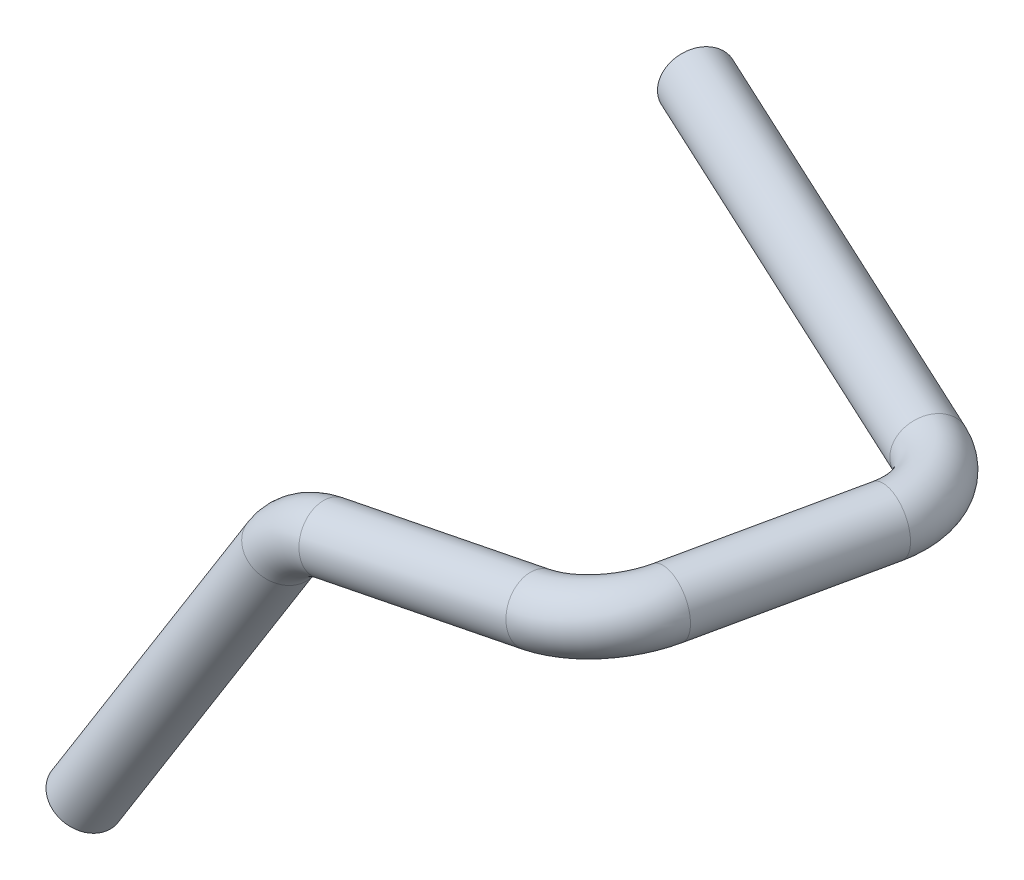
ISO-10303-21;
HEADER;
FILE_DESCRIPTION(('STEP AP214'),'2;1');
FILE_NAME('part.step','',(''),(''),'','','');
FILE_SCHEMA(('AUTOMOTIVE_DESIGN { 1 0 10303 214 1 1 1 1 }'));
ENDSEC;
DATA;
#1=APPLICATION_CONTEXT('core data for automotive mechanical design processes');
#2=APPLICATION_PROTOCOL_DEFINITION('international standard','automotive_design',2000,#1);
#3=PRODUCT_CONTEXT('',#1,'mechanical');
#4=PRODUCT('Part','Part','',(#3));
#5=PRODUCT_RELATED_PRODUCT_CATEGORY('part','',(#4));
#6=PRODUCT_DEFINITION_FORMATION('','',#4);
#7=PRODUCT_DEFINITION_CONTEXT('part definition',#1,'design');
#8=PRODUCT_DEFINITION('design','',#6,#7);
#9=PRODUCT_DEFINITION_SHAPE('','',#8);
#10=(LENGTH_UNIT() NAMED_UNIT(*) SI_UNIT(.MILLI.,.METRE.));
#11=(NAMED_UNIT(*) PLANE_ANGLE_UNIT() SI_UNIT($,.RADIAN.));
#12=(NAMED_UNIT(*) SI_UNIT($,.STERADIAN.) SOLID_ANGLE_UNIT());
#13=UNCERTAINTY_MEASURE_WITH_UNIT(LENGTH_MEASURE(1.E-05),#10,'distance_accuracy_value','');
#14=(GEOMETRIC_REPRESENTATION_CONTEXT(3) GLOBAL_UNCERTAINTY_ASSIGNED_CONTEXT((#13)) GLOBAL_UNIT_ASSIGNED_CONTEXT((#10,
#11,#12)) REPRESENTATION_CONTEXT('',''));
#15=CARTESIAN_POINT('',(0.,0.,0.));
#16=DIRECTION('',(0.,0.,1.));
#17=DIRECTION('',(1.,0.,0.));
#18=AXIS2_PLACEMENT_3D('',#15,#16,#17);
#19=CARTESIAN_POINT('',(-293.907053200826,-176.904078828045,0.));
#20=DIRECTION('',(-0.530756139601212,-0.847524583876844,0.));
#21=DIRECTION('',(0.134753289481936,-0.0843882727234141,0.987279175512457));
#22=AXIS2_PLACEMENT_3D('',#19,#20,#21);
#23=PLANE('',#22);
#24=CARTESIAN_POINT('',(-293.907053200826,-176.904078828045,0.));
#25=DIRECTION('',(-0.530756139601212,-0.847524583876844,0.));
#26=DIRECTION('',(0.134753289481936,-0.0843882727234141,0.987279175512457));
#27=AXIS2_PLACEMENT_3D('',#24,#25,#26);
#28=CIRCLE('',#27,10.);
#29=CARTESIAN_POINT('',(-302.382299039594,-171.596517432033,0.));
#30=VERTEX_POINT('',#29);
#31=EDGE_CURVE('E253',#30,#30,#28,.T.);
#32=ORIENTED_EDGE('',*,*,#31,.F.);
#33=EDGE_LOOP('',(#32));
#34=FACE_BOUND('',#33,.T.);
#35=CARTESIAN_POINT('',(-293.907053200826,-176.904078828045,0.));
#36=DIRECTION('',(-0.530756139601212,-0.847524583876844,0.));
#37=DIRECTION('',(0.847524583876845,-0.530756139601212,0.));
#38=AXIS2_PLACEMENT_3D('',#35,#36,#37);
#39=CIRCLE('',#38,12.);
#40=CARTESIAN_POINT('',(-283.736758194304,-183.273152503259,0.));
#41=VERTEX_POINT('',#40);
#42=EDGE_CURVE('E62',#41,#41,#39,.T.);
#43=ORIENTED_EDGE('',*,*,#42,.T.);
#44=EDGE_LOOP('',(#43));
#45=FACE_BOUND('',#44,.T.);
#46=ADVANCED_FACE('F43',(#34,#45),#23,.T.);
#47=CARTESIAN_POINT('',(-258.99237319652,-16.323468261362,-211.207155938666));
#48=DIRECTION('',(0.906907469997026,0.,0.421329848056833));
#49=DIRECTION('',(0.421329848056833,0.,-0.906907469997026));
#50=AXIS2_PLACEMENT_3D('',#47,#48,#49);
#51=PLANE('',#50);
#52=CARTESIAN_POINT('',(-258.99237319652,-16.323468261362,-211.207155938666));
#53=DIRECTION('',(0.906907469997026,0.,0.421329848056833));
#54=DIRECTION('',(0.421329848056833,0.,-0.906907469997026));
#55=AXIS2_PLACEMENT_3D('',#52,#53,#54);
#56=CIRCLE('',#55,10.);
#57=CARTESIAN_POINT('',(-254.779074715952,-16.323468261362,-220.276230638637));
#58=VERTEX_POINT('',#57);
#59=EDGE_CURVE('E65',#58,#58,#56,.T.);
#60=ORIENTED_EDGE('',*,*,#59,.T.);
#61=EDGE_LOOP('',(#60));
#62=FACE_BOUND('',#61,.T.);
#63=CARTESIAN_POINT('',(-258.99237319652,-16.323468261362,-211.207155938666));
#64=DIRECTION('',(0.906907469997026,0.,0.421329848056833));
#65=DIRECTION('',(0.421329848056833,0.,-0.906907469997026));
#66=AXIS2_PLACEMENT_3D('',#63,#64,#65);
#67=CIRCLE('',#66,12.);
#68=CARTESIAN_POINT('',(-253.936415019838,-16.323468261362,-222.090045578631));
#69=VERTEX_POINT('',#68);
#70=EDGE_CURVE('E11',#69,#69,#67,.T.);
#71=ORIENTED_EDGE('',*,*,#70,.F.);
#72=EDGE_LOOP('',(#71));
#73=FACE_BOUND('',#72,.T.);
#74=ADVANCED_FACE('F139',(#62,#73),#51,.F.);
#75=CARTESIAN_POINT('',(-293.907053200826,-176.904078828045,0.));
#76=DIRECTION('',(0.530756139601212,0.847524583876845,0.));
#77=DIRECTION('',(-0.847524583876845,0.530756139601212,0.));
#78=AXIS2_PLACEMENT_3D('',#75,#76,#77);
#79=CYLINDRICAL_SURFACE('',#78,12.);
#80=CARTESIAN_POINT('',(-215.210942182074,-51.2401745084316,0.));
#81=DIRECTION('',(0.530756139601212,0.847524583876845,0.));
#82=DIRECTION('',(-0.847524583876845,0.530756139601212,0.));
#83=AXIS2_PLACEMENT_3D('',#80,#81,#82);
#84=CIRCLE('',#83,12.);
#85=CARTESIAN_POINT('',(-225.381237188596,-44.871100833217,0.));
#86=VERTEX_POINT('',#85);
#87=EDGE_CURVE('E64',#86,#86,#84,.F.);
#88=ORIENTED_EDGE('',*,*,#87,.T.);
#89=EDGE_LOOP('',(#88));
#90=FACE_BOUND('',#89,.T.);
#91=ORIENTED_EDGE('',*,*,#42,.F.);
#92=EDGE_LOOP('',(#91));
#93=FACE_BOUND('',#92,.T.);
#94=ADVANCED_FACE('F142',(#90,#93),#79,.T.);
#95=CARTESIAN_POINT('',(-189.785204665768,-67.1628586964681,0.));
#96=DIRECTION('',(0.,0.,-1.));
#97=DIRECTION('',(-1.,0.,0.));
#98=AXIS2_PLACEMENT_3D('',#95,#96,#97);
#99=TOROIDAL_SURFACE('',#98,30.,12.);
#100=CARTESIAN_POINT('',(-195.66904996388,-37.7455106768406,0.));
#101=DIRECTION('',(-0.980578267320918,-0.196128176603735,0.));
#102=DIRECTION('',(0.196128176603735,-0.980578267320918,0.));
#103=AXIS2_PLACEMENT_3D('',#100,#101,#102);
#104=CIRCLE('',#103,12.);
#105=CARTESIAN_POINT('',(-198.022588083125,-25.9785714689896,0.));
#106=VERTEX_POINT('',#105);
#107=EDGE_CURVE('E69',#106,#106,#104,.T.);
#108=CARTESIAN_POINT('',(-189.785204665768,-67.1628586964681,0.));
#109=DIRECTION('',(0.,0.,-1.));
#110=DIRECTION('',(-1.,0.,0.));
#111=AXIS2_PLACEMENT_3D('',#108,#109,#110);
#112=CIRCLE('',#111,42.);
#113=EDGE_CURVE('',#86,#106,#112,.T.);
#114=ORIENTED_EDGE('',*,*,#87,.F.);
#115=ORIENTED_EDGE('',*,*,#107,.T.);
#116=ORIENTED_EDGE('',*,*,#113,.T.);
#117=ORIENTED_EDGE('',*,*,#113,.F.);
#118=EDGE_LOOP('',(#114,#116,#115,#117));
#119=FACE_BOUND('',#118,.T.);
#120=ADVANCED_FACE('F148',(#119),#99,.T.);
#121=CARTESIAN_POINT('',(-195.66904996388,-37.7455106768405,0.));
#122=DIRECTION('',(0.980578267320918,0.196128176603737,0.));
#123=DIRECTION('',(-0.196128176603737,0.980578267320918,0.));
#124=AXIS2_PLACEMENT_3D('',#121,#122,#123);
#125=CYLINDRICAL_SURFACE('',#124,12.);
#126=CARTESIAN_POINT('',(-112.434772165673,-21.0975921174252,0.));
#127=DIRECTION('',(0.980578267320918,0.196128176603737,0.));
#128=DIRECTION('',(-0.196128176603737,0.980578267320918,0.));
#129=AXIS2_PLACEMENT_3D('',#126,#127,#128);
#130=CIRCLE('',#129,12.);
#131=CARTESIAN_POINT('',(-112.533874178971,-20.6021136901504,11.9893569435173));
#132=VERTEX_POINT('',#131);
#133=EDGE_CURVE('E83',#132,#132,#130,.F.);
#134=ORIENTED_EDGE('',*,*,#133,.T.);
#135=EDGE_LOOP('',(#134));
#136=FACE_BOUND('',#135,.T.);
#137=ORIENTED_EDGE('',*,*,#107,.F.);
#138=EDGE_LOOP('',(#137));
#139=FACE_BOUND('',#138,.T.);
#140=ADVANCED_FACE('F100',(#136,#139),#125,.T.);
#141=CARTESIAN_POINT('',(-112.187017132428,-22.336288185612,-29.9733923587932));
#142=DIRECTION('',(-0.195954226331949,0.979708571497181,-0.0421076729064874));
#143=DIRECTION('',(-0.980578267320918,-0.196128176603737,0.));
#144=AXIS2_PLACEMENT_3D('',#141,#142,#143);
#145=TOROIDAL_SURFACE('',#144,30.,12.);
#146=CARTESIAN_POINT('',(-83.4517092703334,-16.323468261362,-23.7985985461068));
#147=DIRECTION('',(-0.210089476004418,0.,0.97768216311447));
#148=DIRECTION('',(0.97768216311447,0.,0.210089476004418));
#149=AXIS2_PLACEMENT_3D('',#146,#147,#148);
#150=CIRCLE('',#149,12.);
#151=CARTESIAN_POINT('',(-71.9575861254956,-13.918340291662,-21.3286810210322));
#152=VERTEX_POINT('',#151);
#153=EDGE_CURVE('E59',#152,#152,#150,.T.);
#154=CARTESIAN_POINT('',(-112.187017132428,-22.336288185612,-29.9733923587932));
#155=DIRECTION('',(-0.195954226331949,0.979708571497181,-0.0421076729064874));
#156=DIRECTION('',(-0.980578267320918,-0.196128176603737,0.));
#157=AXIS2_PLACEMENT_3D('',#154,#155,#156);
#158=CIRCLE('',#157,42.);
#159=EDGE_CURVE('',#132,#152,#158,.T.);
#160=ORIENTED_EDGE('',*,*,#133,.F.);
#161=ORIENTED_EDGE('',*,*,#153,.T.);
#162=ORIENTED_EDGE('',*,*,#159,.T.);
#163=ORIENTED_EDGE('',*,*,#159,.F.);
#164=EDGE_LOOP('',(#160,#162,#161,#163));
#165=FACE_BOUND('',#164,.T.);
#166=ADVANCED_FACE('F88',(#165),#145,.T.);
#167=CARTESIAN_POINT('',(-83.4517092703334,-16.323468261362,-23.7985985461067));
#168=DIRECTION('',(0.210089476004422,0.,-0.977682163114469));
#169=DIRECTION('',(-0.977682163114469,0.,-0.210089476004422));
#170=AXIS2_PLACEMENT_3D('',#167,#168,#169);
#171=CYLINDRICAL_SURFACE('',#170,12.);
#172=CARTESIAN_POINT('',(-67.8016970883487,-16.323468261362,-96.628223588955));
#173=DIRECTION('',(0.210089476004422,0.,-0.977682163114469));
#174=DIRECTION('',(-0.977682163114469,0.,-0.210089476004422));
#175=AXIS2_PLACEMENT_3D('',#172,#173,#174);
#176=CIRCLE('',#175,12.);
#177=CARTESIAN_POINT('',(-56.0695111309751,-16.323468261362,-94.107149876902));
#178=VERTEX_POINT('',#177);
#179=EDGE_CURVE('E54',#178,#178,#176,.F.);
#180=ORIENTED_EDGE('',*,*,#179,.T.);
#181=EDGE_LOOP('',(#180));
#182=FACE_BOUND('',#181,.T.);
#183=ORIENTED_EDGE('',*,*,#153,.F.);
#184=EDGE_LOOP('',(#183));
#185=FACE_BOUND('',#184,.T.);
#186=ADVANCED_FACE('F91',(#182,#185),#171,.T.);
#187=CARTESIAN_POINT('',(-97.1321619817828,-16.323468261362,-102.930907869088));
#188=DIRECTION('',(0.,1.,0.));
#189=DIRECTION('',(0.,0.,1.));
#190=AXIS2_PLACEMENT_3D('',#187,#188,#189);
#191=TOROIDAL_SURFACE('',#190,30.,12.);
#192=CARTESIAN_POINT('',(-84.492266540078,-16.323468261362,-130.138131968998));
#193=DIRECTION('',(0.906907469997027,0.,0.421329848056829));
#194=DIRECTION('',(0.421329848056829,0.,-0.906907469997028));
#195=AXIS2_PLACEMENT_3D('',#192,#193,#194);
#196=CIRCLE('',#195,12.);
#197=CARTESIAN_POINT('',(-79.436308363396,-16.323468261362,-141.021021608963));
#198=VERTEX_POINT('',#197);
#199=EDGE_CURVE('E50',#198,#198,#196,.T.);
#200=CARTESIAN_POINT('',(-97.1321619817828,-16.323468261362,-102.930907869088));
#201=DIRECTION('',(0.,1.,0.));
#202=DIRECTION('',(0.,0.,1.));
#203=AXIS2_PLACEMENT_3D('',#200,#201,#202);
#204=CIRCLE('',#203,42.);
#205=EDGE_CURVE('',#178,#198,#204,.T.);
#206=ORIENTED_EDGE('',*,*,#179,.F.);
#207=ORIENTED_EDGE('',*,*,#199,.T.);
#208=ORIENTED_EDGE('',*,*,#205,.T.);
#209=ORIENTED_EDGE('',*,*,#205,.F.);
#210=EDGE_LOOP('',(#206,#208,#207,#209));
#211=FACE_BOUND('',#210,.T.);
#212=ADVANCED_FACE('F93',(#211),#191,.T.);
#213=CARTESIAN_POINT('',(-84.492266540078,-16.323468261362,-130.138131968998));
#214=DIRECTION('',(-0.906907469997026,0.,-0.421329848056833));
#215=DIRECTION('',(-0.421329848056833,0.,0.906907469997026));
#216=AXIS2_PLACEMENT_3D('',#213,#214,#215);
#217=CYLINDRICAL_SURFACE('',#216,12.);
#218=ORIENTED_EDGE('',*,*,#70,.T.);
#219=EDGE_LOOP('',(#218));
#220=FACE_BOUND('',#219,.T.);
#221=ORIENTED_EDGE('',*,*,#199,.F.);
#222=EDGE_LOOP('',(#221));
#223=FACE_BOUND('',#222,.T.);
#224=ADVANCED_FACE('F45',(#220,#223),#217,.T.);
#225=CARTESIAN_POINT('',(-293.907053200826,-176.904078828045,0.));
#226=DIRECTION('',(0.530756139601212,0.847524583876845,0.));
#227=DIRECTION('',(-0.847524583876845,0.530756139601212,0.));
#228=AXIS2_PLACEMENT_3D('',#225,#226,#227);
#229=CYLINDRICAL_SURFACE('',#228,10.);
#230=CARTESIAN_POINT('',(-215.210942182074,-51.2401745084317,0.));
#231=DIRECTION('',(-0.530756139601212,-0.847524583876844,0.));
#232=DIRECTION('',(0.134753289481936,-0.0843882727234141,0.987279175512457));
#233=AXIS2_PLACEMENT_3D('',#230,#231,#232);
#234=CIRCLE('',#233,10.);
#235=CARTESIAN_POINT('',(-223.686188020842,-45.9326131124195,0.));
#236=VERTEX_POINT('',#235);
#237=EDGE_CURVE('E254',#236,#236,#234,.T.);
#238=CARTESIAN_POINT('',(-223.686188020842,-45.9326131124195,0.));
#239=CARTESIAN_POINT('',(-224.505939177287,-47.2416121157488,0.));
#240=CARTESIAN_POINT('',(-225.325690333733,-48.5506111190781,0.));
#241=CARTESIAN_POINT('',(-226.965192646623,-51.1686091257368,0.));
#242=CARTESIAN_POINT('',(-227.784943803069,-52.477608129066,0.));
#243=CARTESIAN_POINT('',(-229.424446115959,-55.0956061357247,0.));
#244=CARTESIAN_POINT('',(-230.244197272405,-56.404605139054,0.));
#245=CARTESIAN_POINT('',(-231.883699585295,-59.0226031457126,0.));
#246=CARTESIAN_POINT('',(-232.703450741741,-60.3316021490419,0.));
#247=CARTESIAN_POINT('',(-234.342953054631,-62.9496001557005,0.));
#248=CARTESIAN_POINT('',(-235.162704211077,-64.2585991590298,0.));
#249=CARTESIAN_POINT('',(-236.802206523967,-66.8765971656884,0.));
#250=CARTESIAN_POINT('',(-237.621957680413,-68.1855961690177,0.));
#251=CARTESIAN_POINT('',(-239.261459993303,-70.8035941756763,0.));
#252=CARTESIAN_POINT('',(-240.081211149749,-72.1125931790056,0.));
#253=CARTESIAN_POINT('',(-241.720713462639,-74.7305911856642,0.));
#254=CARTESIAN_POINT('',(-242.540464619085,-76.0395901889935,0.));
#255=CARTESIAN_POINT('',(-244.179966931975,-78.6575881956521,0.));
#256=CARTESIAN_POINT('',(-244.999718088421,-79.9665871989814,0.));
#257=CARTESIAN_POINT('',(-246.639220401311,-82.5845852056401,0.));
#258=CARTESIAN_POINT('',(-247.458971557757,-83.8935842089693,0.));
#259=CARTESIAN_POINT('',(-249.098473870647,-86.511582215628,0.));
#260=CARTESIAN_POINT('',(-249.918225027093,-87.8205812189573,0.));
#261=CARTESIAN_POINT('',(-251.557727339983,-90.4385792256159,0.));
#262=CARTESIAN_POINT('',(-252.377478496429,-91.7475782289452,0.));
#263=CARTESIAN_POINT('',(-254.016980809319,-94.3655762356038,0.));
#264=CARTESIAN_POINT('',(-254.836731965765,-95.6745752389331,0.));
#265=CARTESIAN_POINT('',(-256.476234278655,-98.2925732455917,0.));
#266=CARTESIAN_POINT('',(-257.295985435101,-99.601572248921,0.));
#267=CARTESIAN_POINT('',(-258.935487747991,-102.21957025558,0.));
#268=CARTESIAN_POINT('',(-259.755238904437,-103.528569258909,0.));
#269=CARTESIAN_POINT('',(-261.394741217327,-106.146567265568,0.));
#270=CARTESIAN_POINT('',(-262.214492373773,-107.455566268897,0.));
#271=CARTESIAN_POINT('',(-263.853994686663,-110.073564275555,0.));
#272=CARTESIAN_POINT('',(-264.673745843109,-111.382563278885,0.));
#273=CARTESIAN_POINT('',(-266.313248155999,-114.000561285543,0.));
#274=CARTESIAN_POINT('',(-267.132999312445,-115.309560288873,0.));
#275=CARTESIAN_POINT('',(-268.772501625336,-117.927558295531,0.));
#276=CARTESIAN_POINT('',(-269.592252781781,-119.236557298861,0.));
#277=CARTESIAN_POINT('',(-271.231755094671,-121.854555305519,0.));
#278=CARTESIAN_POINT('',(-272.051506251117,-123.163554308848,0.));
#279=CARTESIAN_POINT('',(-273.691008564008,-125.781552315507,0.));
#280=CARTESIAN_POINT('',(-274.510759720453,-127.090551318836,0.));
#281=CARTESIAN_POINT('',(-276.150262033344,-129.708549325495,0.));
#282=CARTESIAN_POINT('',(-276.970013189789,-131.017548328824,0.));
#283=CARTESIAN_POINT('',(-278.60951550268,-133.635546335483,0.));
#284=CARTESIAN_POINT('',(-279.429266659125,-134.944545338812,0.));
#285=CARTESIAN_POINT('',(-281.068768972016,-137.562543345471,0.));
#286=CARTESIAN_POINT('',(-281.888520128461,-138.8715423488,0.));
#287=CARTESIAN_POINT('',(-283.528022441352,-141.489540355459,0.));
#288=CARTESIAN_POINT('',(-284.347773597797,-142.798539358788,0.));
#289=CARTESIAN_POINT('',(-285.987275910688,-145.416537365447,0.));
#290=CARTESIAN_POINT('',(-286.807027067133,-146.725536368776,0.));
#291=CARTESIAN_POINT('',(-288.446529380024,-149.343534375435,0.));
#292=CARTESIAN_POINT('',(-289.266280536469,-150.652533378764,0.));
#293=CARTESIAN_POINT('',(-290.90578284936,-153.270531385422,0.));
#294=CARTESIAN_POINT('',(-291.725534005805,-154.579530388752,0.));
#295=CARTESIAN_POINT('',(-293.365036318696,-157.19752839541,0.));
#296=CARTESIAN_POINT('',(-294.184787475141,-158.50652739874,0.));
#297=CARTESIAN_POINT('',(-295.824289788032,-161.124525405398,0.));
#298=CARTESIAN_POINT('',(-296.644040944477,-162.433524408728,0.));
#299=CARTESIAN_POINT('',(-298.283543257368,-165.051522415386,0.));
#300=CARTESIAN_POINT('',(-299.103294413813,-166.360521418715,0.));
#301=CARTESIAN_POINT('',(-300.742796726704,-168.978519425374,0.));
#302=CARTESIAN_POINT('',(-301.562547883149,-170.287518428703,0.));
#303=CARTESIAN_POINT('',(-302.382299039594,-171.596517432033,0.));
#304=B_SPLINE_CURVE_WITH_KNOTS('',3,(#238,#239,#240,#241,#242,#243,#244,#245,#246,#247,#248,
#249,#250,#251,#252,#253,#254,#255,#256,#257,#258,#259,#260,#261,#262,#263,#264,#265,#266,#267,
#268,#269,#270,#271,#272,#273,#274,#275,#276,#277,#278,#279,#280,#281,#282,#283,#284,#285,#286,
#287,#288,#289,#290,#291,#292,#293,#294,#295,#296,#297,#298,#299,#300,#301,#302,#303),
.UNSPECIFIED.,.F.,.F.,(4,2,2,2,2,2,2,2,2,2,2,2,2,2,2,2,2,2,2,2,2,2,2,2,2,2,2,2,2,2,2,2,4),(0.,
4.63349038446129,9.26698076892258,13.9004711533839,18.5339615378452,23.1674519223064,
27.8009423067677,32.434432691229,37.0679230756903,41.7014134601516,46.3349038446129,
50.9683942290741,55.6018846135354,60.2353749979967,64.868865382458,69.5023557669193,
74.1358461513806,78.7693365358419,83.4028269203031,88.0363173047644,92.6698076892257,
97.303298073687,101.936788458148,106.57027884261,111.203769227071,115.837259611532,
120.470749995993,125.104240380455,129.737730764916,134.371221149377,139.004711533839,
143.6382019183,148.271692302761),.UNSPECIFIED.);
#305=EDGE_CURVE('BSEAM103',#236,#30,#304,.T.);
#306=ORIENTED_EDGE('',*,*,#237,.F.);
#307=ORIENTED_EDGE('',*,*,#31,.T.);
#308=ORIENTED_EDGE('',*,*,#305,.T.);
#309=ORIENTED_EDGE('',*,*,#305,.F.);
#310=EDGE_LOOP('',(#306,#308,#307,#309));
#311=FACE_BOUND('',#310,.T.);
#312=ADVANCED_FACE('F103',(#311),#229,.F.);
#313=CARTESIAN_POINT('',(-189.785204665768,-67.1628586964681,0.));
#314=DIRECTION('',(0.,0.,-1.));
#315=DIRECTION('',(-1.,0.,0.));
#316=AXIS2_PLACEMENT_3D('',#313,#314,#315);
#317=TOROIDAL_SURFACE('',#316,30.,10.);
#318=CARTESIAN_POINT('',(-195.66904996388,-37.7455106768406,0.));
#319=DIRECTION('',(-0.980578267320918,-0.196128176603737,0.));
#320=DIRECTION('',(0.0311836582209251,-0.155908335439143,0.987279175512457));
#321=AXIS2_PLACEMENT_3D('',#318,#319,#320);
#322=CIRCLE('',#321,10.);
#323=CARTESIAN_POINT('',(-197.630331729918,-27.9397280036314,0.));
#324=VERTEX_POINT('',#323);
#325=EDGE_CURVE('E257',#324,#324,#322,.T.);
#326=CARTESIAN_POINT('',(-189.785204665768,-67.1628586964681,0.));
#327=DIRECTION('',(0.,0.,-1.));
#328=DIRECTION('',(-1.,0.,0.));
#329=AXIS2_PLACEMENT_3D('',#326,#327,#328);
#330=CIRCLE('',#329,40.);
#331=EDGE_CURVE('',#236,#324,#330,.T.);
#332=ORIENTED_EDGE('',*,*,#237,.T.);
#333=ORIENTED_EDGE('',*,*,#325,.F.);
#334=ORIENTED_EDGE('',*,*,#331,.T.);
#335=ORIENTED_EDGE('',*,*,#331,.F.);
#336=EDGE_LOOP('',(#332,#334,#333,#335));
#337=FACE_BOUND('',#336,.T.);
#338=ADVANCED_FACE('F107',(#337),#317,.F.);
#339=CARTESIAN_POINT('',(-195.66904996388,-37.7455106768405,0.));
#340=DIRECTION('',(0.980578267320918,0.196128176603737,0.));
#341=DIRECTION('',(-0.196128176603737,0.980578267320918,0.));
#342=AXIS2_PLACEMENT_3D('',#339,#340,#341);
#343=CYLINDRICAL_SURFACE('',#342,10.);
#344=CARTESIAN_POINT('',(-112.434772165673,-21.0975921174252,0.));
#345=DIRECTION('',(-0.980578267320918,-0.196128176603737,0.));
#346=DIRECTION('',(0.0311836582209252,-0.155908335439143,0.987279175512457));
#347=AXIS2_PLACEMENT_3D('',#344,#345,#346);
#348=CIRCLE('',#347,10.);
#349=CARTESIAN_POINT('',(-112.517357176755,-20.6846934280296,9.9911307862644));
#350=VERTEX_POINT('',#349);
#351=EDGE_CURVE('E262',#350,#350,#348,.T.);
#352=ORIENTED_EDGE('',*,*,#351,.F.);
#353=EDGE_LOOP('',(#352));
#354=FACE_BOUND('',#353,.T.);
#355=ORIENTED_EDGE('',*,*,#325,.T.);
#356=EDGE_LOOP('',(#355));
#357=FACE_BOUND('',#356,.T.);
#358=ADVANCED_FACE('F114',(#354,#357),#343,.F.);
#359=CARTESIAN_POINT('',(-112.187017132428,-22.336288185612,-29.9733923587932));
#360=DIRECTION('',(-0.195954226331949,0.979708571497181,-0.0421076729064874));
#361=DIRECTION('',(-0.980578267320918,-0.196128176603737,0.));
#362=AXIS2_PLACEMENT_3D('',#359,#360,#361);
#363=TOROIDAL_SURFACE('',#362,30.,10.);
#364=CARTESIAN_POINT('',(-83.4517092703334,-16.323468261362,-23.7985985461067));
#365=DIRECTION('',(-0.210089476004423,0.,0.977682163114469));
#366=DIRECTION('',(0.977682163114469,0.,0.210089476004423));
#367=AXIS2_PLACEMENT_3D('',#364,#365,#366);
#368=CIRCLE('',#367,10.);
#369=CARTESIAN_POINT('',(-73.8732733163019,-14.3191949532787,-21.7403339418779));
#370=VERTEX_POINT('',#369);
#371=EDGE_CURVE('E265',#370,#370,#368,.T.);
#372=CARTESIAN_POINT('',(-112.187017132428,-22.336288185612,-29.9733923587932));
#373=DIRECTION('',(-0.195954226331949,0.979708571497181,-0.0421076729064874));
#374=DIRECTION('',(-0.980578267320918,-0.196128176603737,0.));
#375=AXIS2_PLACEMENT_3D('',#372,#373,#374);
#376=CIRCLE('',#375,40.);
#377=EDGE_CURVE('',#350,#370,#376,.T.);
#378=ORIENTED_EDGE('',*,*,#351,.T.);
#379=ORIENTED_EDGE('',*,*,#371,.F.);
#380=ORIENTED_EDGE('',*,*,#377,.T.);
#381=ORIENTED_EDGE('',*,*,#377,.F.);
#382=EDGE_LOOP('',(#378,#380,#379,#381));
#383=FACE_BOUND('',#382,.T.);
#384=ADVANCED_FACE('F122',(#383),#363,.F.);
#385=CARTESIAN_POINT('',(-83.4517092703334,-16.323468261362,-23.7985985461067));
#386=DIRECTION('',(0.210089476004422,0.,-0.977682163114469));
#387=DIRECTION('',(-0.977682163114469,0.,-0.210089476004422));
#388=AXIS2_PLACEMENT_3D('',#385,#386,#387);
#389=CYLINDRICAL_SURFACE('',#388,10.);
#390=CARTESIAN_POINT('',(-67.8016970883487,-16.323468261362,-96.628223588955));
#391=DIRECTION('',(-0.210089476004423,0.,0.977682163114469));
#392=DIRECTION('',(0.977682163114469,0.,0.210089476004423));
#393=AXIS2_PLACEMENT_3D('',#390,#391,#392);
#394=CIRCLE('',#393,10.);
#395=CARTESIAN_POINT('',(-58.024875457204,-16.323468261362,-94.5273288289108));
#396=VERTEX_POINT('',#395);
#397=EDGE_CURVE('E77',#396,#396,#394,.T.);
#398=ORIENTED_EDGE('',*,*,#397,.F.);
#399=EDGE_LOOP('',(#398));
#400=FACE_BOUND('',#399,.T.);
#401=ORIENTED_EDGE('',*,*,#371,.T.);
#402=EDGE_LOOP('',(#401));
#403=FACE_BOUND('',#402,.T.);
#404=ADVANCED_FACE('F126',(#400,#403),#389,.F.);
#405=CARTESIAN_POINT('',(-97.1321619817828,-16.323468261362,-102.930907869088));
#406=DIRECTION('',(0.,1.,0.));
#407=DIRECTION('',(0.,0.,1.));
#408=AXIS2_PLACEMENT_3D('',#405,#406,#407);
#409=TOROIDAL_SURFACE('',#408,30.,10.);
#410=CARTESIAN_POINT('',(-84.4922665400779,-16.323468261362,-130.138131968999));
#411=DIRECTION('',(0.906907469997026,0.,0.421329848056833));
#412=DIRECTION('',(0.421329848056833,0.,-0.906907469997026));
#413=AXIS2_PLACEMENT_3D('',#410,#411,#412);
#414=CIRCLE('',#413,10.);
#415=CARTESIAN_POINT('',(-80.2789680595096,-16.323468261362,-139.207206668969));
#416=VERTEX_POINT('',#415);
#417=EDGE_CURVE('E72',#416,#416,#414,.T.);
#418=CARTESIAN_POINT('',(-97.1321619817828,-16.323468261362,-102.930907869088));
#419=DIRECTION('',(0.,1.,0.));
#420=DIRECTION('',(0.,0.,1.));
#421=AXIS2_PLACEMENT_3D('',#418,#419,#420);
#422=CIRCLE('',#421,40.);
#423=EDGE_CURVE('',#396,#416,#422,.T.);
#424=ORIENTED_EDGE('',*,*,#397,.T.);
#425=ORIENTED_EDGE('',*,*,#417,.F.);
#426=ORIENTED_EDGE('',*,*,#423,.T.);
#427=ORIENTED_EDGE('',*,*,#423,.F.);
#428=EDGE_LOOP('',(#424,#426,#425,#427));
#429=FACE_BOUND('',#428,.T.);
#430=ADVANCED_FACE('F130',(#429),#409,.F.);
#431=CARTESIAN_POINT('',(-84.492266540078,-16.323468261362,-130.138131968998));
#432=DIRECTION('',(-0.906907469997026,0.,-0.421329848056833));
#433=DIRECTION('',(-0.421329848056833,0.,0.906907469997026));
#434=AXIS2_PLACEMENT_3D('',#431,#432,#433);
#435=CYLINDRICAL_SURFACE('',#434,10.);
#436=ORIENTED_EDGE('',*,*,#59,.F.);
#437=EDGE_LOOP('',(#436));
#438=FACE_BOUND('',#437,.T.);
#439=ORIENTED_EDGE('',*,*,#417,.T.);
#440=EDGE_LOOP('',(#439));
#441=FACE_BOUND('',#440,.T.);
#442=ADVANCED_FACE('F134',(#438,#441),#435,.F.);
#443=CLOSED_SHELL('',(#46,#74,#94,#120,#140,#166,#186,#212,#224,#312,#338,#358,#384,#404,#430,#442));
#444=MANIFOLD_SOLID_BREP('B2',#443);
#445=ADVANCED_BREP_SHAPE_REPRESENTATION('',(#18,#444),#14);
#446=SHAPE_DEFINITION_REPRESENTATION(#9,#445);
ENDSEC;
END-ISO-10303-21;
